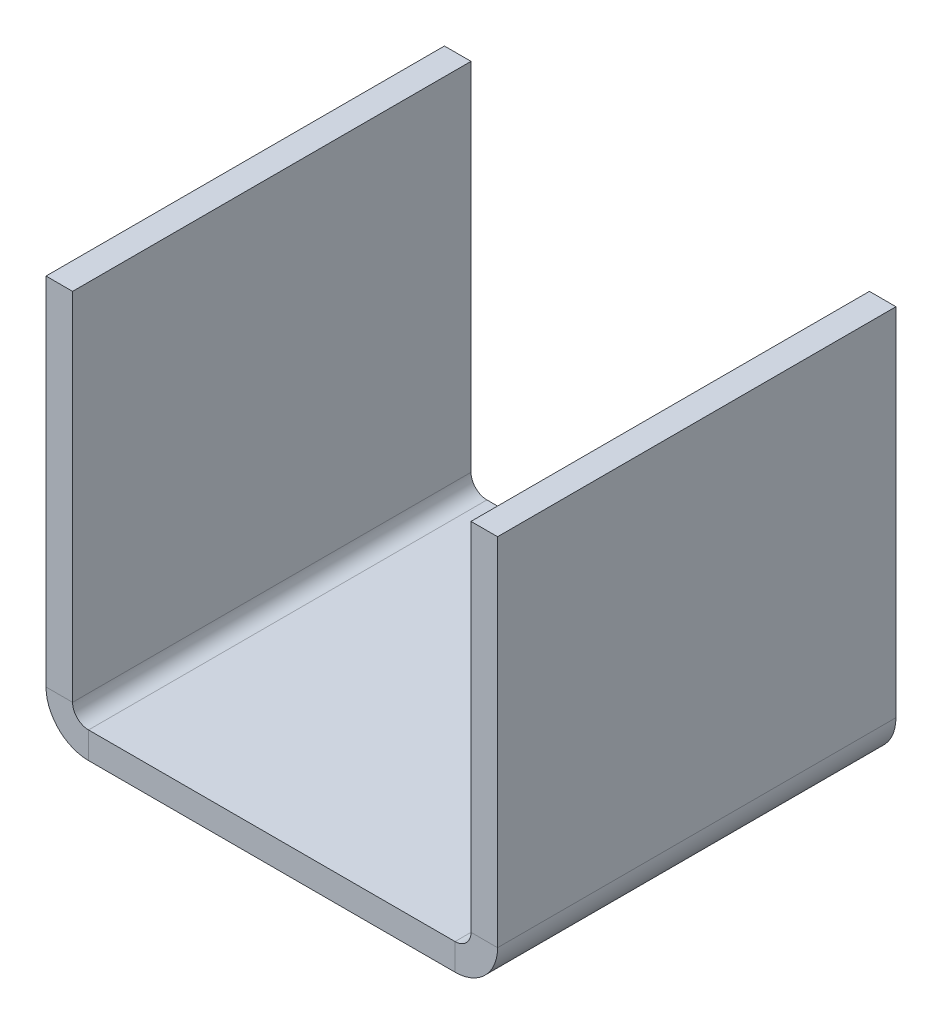
ISO-10303-21;
HEADER;
FILE_DESCRIPTION(('STEP AP214'),'2;1');
FILE_NAME('part.step','',(''),(''),'','','');
FILE_SCHEMA(('AUTOMOTIVE_DESIGN { 1 0 10303 214 1 1 1 1 }'));
ENDSEC;
DATA;
#1=APPLICATION_CONTEXT('core data for automotive mechanical design processes');
#2=APPLICATION_PROTOCOL_DEFINITION('international standard','automotive_design',2000,#1);
#3=PRODUCT_CONTEXT('',#1,'mechanical');
#4=PRODUCT('Part','Part','',(#3));
#5=PRODUCT_RELATED_PRODUCT_CATEGORY('part','',(#4));
#6=PRODUCT_DEFINITION_FORMATION('','',#4);
#7=PRODUCT_DEFINITION_CONTEXT('part definition',#1,'design');
#8=PRODUCT_DEFINITION('design','',#6,#7);
#9=PRODUCT_DEFINITION_SHAPE('','',#8);
#10=(LENGTH_UNIT() NAMED_UNIT(*) SI_UNIT(.MILLI.,.METRE.));
#11=(NAMED_UNIT(*) PLANE_ANGLE_UNIT() SI_UNIT($,.RADIAN.));
#12=(NAMED_UNIT(*) SI_UNIT($,.STERADIAN.) SOLID_ANGLE_UNIT());
#13=UNCERTAINTY_MEASURE_WITH_UNIT(LENGTH_MEASURE(1.E-05),#10,'distance_accuracy_value','');
#14=(GEOMETRIC_REPRESENTATION_CONTEXT(3) GLOBAL_UNCERTAINTY_ASSIGNED_CONTEXT((#13)) GLOBAL_UNIT_ASSIGNED_CONTEXT((#10,
#11,#12)) REPRESENTATION_CONTEXT('',''));
#15=CARTESIAN_POINT('',(0.,0.,0.));
#16=DIRECTION('',(0.,0.,1.));
#17=DIRECTION('',(1.,0.,0.));
#18=AXIS2_PLACEMENT_3D('',#15,#16,#17);
#19=CARTESIAN_POINT('',(-13.8,-2.,15.));
#20=DIRECTION('',(0.,0.,1.));
#21=DIRECTION('',(1.,0.,0.));
#22=AXIS2_PLACEMENT_3D('',#19,#20,#21);
#23=PLANE('',#22);
#24=DIRECTION('',(1.,0.,0.));
#25=VECTOR('',#24,1.);
#26=CARTESIAN_POINT('',(-13.8,0.,15.));
#27=LINE('',#26,#25);
#28=CARTESIAN_POINT('',(-13.8,0.,15.));
#29=VERTEX_POINT('',#28);
#30=CARTESIAN_POINT('',(13.8,0.,15.));
#31=VERTEX_POINT('',#30);
#32=EDGE_CURVE('E119',#29,#31,#27,.T.);
#33=ORIENTED_EDGE('',*,*,#32,.F.);
#34=DIRECTION('',(0.,1.,0.));
#35=VECTOR('',#34,1.);
#36=CARTESIAN_POINT('',(-13.8,-2.,15.));
#37=LINE('',#36,#35);
#38=CARTESIAN_POINT('',(-13.8,-2.,15.));
#39=VERTEX_POINT('',#38);
#40=EDGE_CURVE('E87',#39,#29,#37,.T.);
#41=ORIENTED_EDGE('',*,*,#40,.F.);
#42=DIRECTION('',(1.,0.,0.));
#43=VECTOR('',#42,1.);
#44=CARTESIAN_POINT('',(-13.8,-2.,15.));
#45=LINE('',#44,#43);
#46=CARTESIAN_POINT('',(13.8,-2.,15.));
#47=VERTEX_POINT('',#46);
#48=EDGE_CURVE('E121',#39,#47,#45,.T.);
#49=ORIENTED_EDGE('',*,*,#48,.T.);
#50=DIRECTION('',(0.,1.,0.));
#51=VECTOR('',#50,1.);
#52=CARTESIAN_POINT('',(13.8,-2.,15.));
#53=LINE('',#52,#51);
#54=EDGE_CURVE('E13',#47,#31,#53,.T.);
#55=ORIENTED_EDGE('',*,*,#54,.T.);
#56=EDGE_LOOP('',(#33,#41,#49,#55));
#57=FACE_BOUND('',#56,.T.);
#58=ADVANCED_FACE('F77',(#57),#23,.T.);
#59=CARTESIAN_POINT('',(-13.8,-2.,-15.));
#60=DIRECTION('',(0.,0.,-1.));
#61=DIRECTION('',(-1.,0.,0.));
#62=AXIS2_PLACEMENT_3D('',#59,#60,#61);
#63=PLANE('',#62);
#64=DIRECTION('',(-1.,0.,0.));
#65=VECTOR('',#64,1.);
#66=CARTESIAN_POINT('',(-13.8,0.,-15.));
#67=LINE('',#66,#65);
#68=CARTESIAN_POINT('',(13.8,0.,-15.));
#69=VERTEX_POINT('',#68);
#70=CARTESIAN_POINT('',(-13.8,0.,-15.));
#71=VERTEX_POINT('',#70);
#72=EDGE_CURVE('E142',#69,#71,#67,.T.);
#73=ORIENTED_EDGE('',*,*,#72,.F.);
#74=DIRECTION('',(0.,1.,0.));
#75=VECTOR('',#74,1.);
#76=CARTESIAN_POINT('',(13.8,-2.,-15.));
#77=LINE('',#76,#75);
#78=CARTESIAN_POINT('',(13.8,-2.,-15.));
#79=VERTEX_POINT('',#78);
#80=EDGE_CURVE('E81',#79,#69,#77,.T.);
#81=ORIENTED_EDGE('',*,*,#80,.F.);
#82=DIRECTION('',(-1.,0.,0.));
#83=VECTOR('',#82,1.);
#84=CARTESIAN_POINT('',(-13.8,-2.,-15.));
#85=LINE('',#84,#83);
#86=CARTESIAN_POINT('',(-13.8,-2.,-15.));
#87=VERTEX_POINT('',#86);
#88=EDGE_CURVE('E158',#79,#87,#85,.T.);
#89=ORIENTED_EDGE('',*,*,#88,.T.);
#90=DIRECTION('',(0.,1.,0.));
#91=VECTOR('',#90,1.);
#92=CARTESIAN_POINT('',(-13.8,-2.,-15.));
#93=LINE('',#92,#91);
#94=EDGE_CURVE('E167',#87,#71,#93,.T.);
#95=ORIENTED_EDGE('',*,*,#94,.T.);
#96=EDGE_LOOP('',(#73,#81,#89,#95));
#97=FACE_BOUND('',#96,.T.);
#98=ADVANCED_FACE('F79',(#97),#63,.T.);
#99=CARTESIAN_POINT('',(0.,-2.,0.));
#100=DIRECTION('',(0.,1.,0.));
#101=DIRECTION('',(0.,0.,1.));
#102=AXIS2_PLACEMENT_3D('',#99,#100,#101);
#103=PLANE('',#102);
#104=DIRECTION('',(0.,0.,-1.));
#105=VECTOR('',#104,1.);
#106=CARTESIAN_POINT('',(13.8,-2.,-15.));
#107=LINE('',#106,#105);
#108=EDGE_CURVE('E96',#47,#79,#107,.T.);
#109=ORIENTED_EDGE('',*,*,#108,.F.);
#110=ORIENTED_EDGE('',*,*,#48,.F.);
#111=DIRECTION('',(0.,0.,1.));
#112=VECTOR('',#111,1.);
#113=CARTESIAN_POINT('',(-13.8,-2.,-15.));
#114=LINE('',#113,#112);
#115=EDGE_CURVE('E161',#87,#39,#114,.T.);
#116=ORIENTED_EDGE('',*,*,#115,.F.);
#117=ORIENTED_EDGE('',*,*,#88,.F.);
#118=EDGE_LOOP('',(#109,#110,#116,#117));
#119=FACE_BOUND('',#118,.T.);
#120=ADVANCED_FACE('F339',(#119),#103,.F.);
#121=CARTESIAN_POINT('',(0.,0.,0.));
#122=DIRECTION('',(0.,1.,0.));
#123=DIRECTION('',(0.,0.,1.));
#124=AXIS2_PLACEMENT_3D('',#121,#122,#123);
#125=PLANE('',#124);
#126=DIRECTION('',(0.,0.,-1.));
#127=VECTOR('',#126,1.);
#128=CARTESIAN_POINT('',(13.8,0.,-15.));
#129=LINE('',#128,#127);
#130=EDGE_CURVE('E129',#31,#69,#129,.T.);
#131=ORIENTED_EDGE('',*,*,#130,.T.);
#132=ORIENTED_EDGE('',*,*,#72,.T.);
#133=DIRECTION('',(0.,0.,1.));
#134=VECTOR('',#133,1.);
#135=CARTESIAN_POINT('',(-13.8,0.,-15.));
#136=LINE('',#135,#134);
#137=EDGE_CURVE('E114',#71,#29,#136,.T.);
#138=ORIENTED_EDGE('',*,*,#137,.T.);
#139=ORIENTED_EDGE('',*,*,#32,.T.);
#140=EDGE_LOOP('',(#131,#132,#138,#139));
#141=FACE_BOUND('',#140,.T.);
#142=ADVANCED_FACE('F128',(#141),#125,.T.);
#143=CARTESIAN_POINT('',(13.8,1.2,15.));
#144=DIRECTION('',(0.,0.,1.));
#145=DIRECTION('',(0.,-1.,0.));
#146=AXIS2_PLACEMENT_3D('',#143,#144,#145);
#147=PLANE('',#146);
#148=DIRECTION('',(-1.,0.,0.));
#149=VECTOR('',#148,1.);
#150=CARTESIAN_POINT('',(17.,1.19999999999999,15.));
#151=LINE('',#150,#149);
#152=CARTESIAN_POINT('',(15.,1.2,15.));
#153=VERTEX_POINT('',#152);
#154=CARTESIAN_POINT('',(17.,1.19999999999999,15.));
#155=VERTEX_POINT('',#154);
#156=EDGE_CURVE('E148',#153,#155,#151,.F.);
#157=ORIENTED_EDGE('',*,*,#156,.F.);
#158=CARTESIAN_POINT('',(13.8,1.2,15.));
#159=DIRECTION('',(0.,0.,-1.));
#160=DIRECTION('',(0.,1.,0.));
#161=AXIS2_PLACEMENT_3D('',#158,#159,#160);
#162=CIRCLE('',#161,1.2);
#163=EDGE_CURVE('E138',#31,#153,#162,.F.);
#164=ORIENTED_EDGE('',*,*,#163,.F.);
#165=ORIENTED_EDGE('',*,*,#54,.F.);
#166=CARTESIAN_POINT('',(13.8,1.2,15.));
#167=DIRECTION('',(0.,0.,-1.));
#168=DIRECTION('',(0.,1.,0.));
#169=AXIS2_PLACEMENT_3D('',#166,#167,#168);
#170=CIRCLE('',#169,3.2);
#171=EDGE_CURVE('E143',#47,#155,#170,.F.);
#172=ORIENTED_EDGE('',*,*,#171,.T.);
#173=EDGE_LOOP('',(#157,#164,#165,#172));
#174=FACE_BOUND('',#173,.T.);
#175=ADVANCED_FACE('F146',(#174),#147,.T.);
#176=CARTESIAN_POINT('',(13.8,1.2,-15.));
#177=DIRECTION('',(0.,0.,1.));
#178=DIRECTION('',(0.,-1.,0.));
#179=AXIS2_PLACEMENT_3D('',#176,#177,#178);
#180=PLANE('',#179);
#181=CARTESIAN_POINT('',(13.8,1.2,-15.));
#182=DIRECTION('',(0.,0.,-1.));
#183=DIRECTION('',(0.,1.,0.));
#184=AXIS2_PLACEMENT_3D('',#181,#182,#183);
#185=CIRCLE('',#184,1.2);
#186=CARTESIAN_POINT('',(15.,1.2,-15.));
#187=VERTEX_POINT('',#186);
#188=EDGE_CURVE('E141',#187,#69,#185,.T.);
#189=ORIENTED_EDGE('',*,*,#188,.F.);
#190=DIRECTION('',(-1.,0.,0.));
#191=VECTOR('',#190,1.);
#192=CARTESIAN_POINT('',(15.,1.2,-15.));
#193=LINE('',#192,#191);
#194=CARTESIAN_POINT('',(17.,1.19999999999999,-15.));
#195=VERTEX_POINT('',#194);
#196=EDGE_CURVE('E190',#187,#195,#193,.F.);
#197=ORIENTED_EDGE('',*,*,#196,.T.);
#198=CARTESIAN_POINT('',(13.8,1.2,-15.));
#199=DIRECTION('',(0.,0.,-1.));
#200=DIRECTION('',(0.,1.,0.));
#201=AXIS2_PLACEMENT_3D('',#198,#199,#200);
#202=CIRCLE('',#201,3.2);
#203=EDGE_CURVE('E149',#195,#79,#202,.T.);
#204=ORIENTED_EDGE('',*,*,#203,.T.);
#205=ORIENTED_EDGE('',*,*,#80,.T.);
#206=EDGE_LOOP('',(#189,#197,#204,#205));
#207=FACE_BOUND('',#206,.T.);
#208=ADVANCED_FACE('F172',(#207),#180,.F.);
#209=CARTESIAN_POINT('',(13.8,1.2,-15.));
#210=DIRECTION('',(0.,0.,-1.));
#211=DIRECTION('',(1.,0.,0.));
#212=AXIS2_PLACEMENT_3D('',#209,#210,#211);
#213=CYLINDRICAL_SURFACE('',#212,3.2);
#214=ORIENTED_EDGE('',*,*,#108,.T.);
#215=ORIENTED_EDGE('',*,*,#203,.F.);
#216=DIRECTION('',(0.,0.,-1.));
#217=VECTOR('',#216,1.);
#218=CARTESIAN_POINT('',(17.,1.19999999999999,15.));
#219=LINE('',#218,#217);
#220=EDGE_CURVE('E184',#195,#155,#219,.F.);
#221=ORIENTED_EDGE('',*,*,#220,.T.);
#222=ORIENTED_EDGE('',*,*,#171,.F.);
#223=EDGE_LOOP('',(#214,#215,#221,#222));
#224=FACE_BOUND('',#223,.T.);
#225=ADVANCED_FACE('F180',(#224),#213,.T.);
#226=CARTESIAN_POINT('',(13.8,1.2,-15.));
#227=DIRECTION('',(0.,0.,-1.));
#228=DIRECTION('',(1.,0.,0.));
#229=AXIS2_PLACEMENT_3D('',#226,#227,#228);
#230=CYLINDRICAL_SURFACE('',#229,1.2);
#231=ORIENTED_EDGE('',*,*,#130,.F.);
#232=ORIENTED_EDGE('',*,*,#163,.T.);
#233=DIRECTION('',(0.,0.,-1.));
#234=VECTOR('',#233,1.);
#235=CARTESIAN_POINT('',(15.,1.2,15.));
#236=LINE('',#235,#234);
#237=EDGE_CURVE('E187',#153,#187,#236,.T.);
#238=ORIENTED_EDGE('',*,*,#237,.T.);
#239=ORIENTED_EDGE('',*,*,#188,.T.);
#240=EDGE_LOOP('',(#231,#232,#238,#239));
#241=FACE_BOUND('',#240,.T.);
#242=ADVANCED_FACE('F135',(#241),#230,.F.);
#243=CARTESIAN_POINT('',(17.0000000000001,28.,-15.));
#244=DIRECTION('',(0.,0.,1.));
#245=DIRECTION('',(0.,-1.,0.));
#246=AXIS2_PLACEMENT_3D('',#243,#244,#245);
#247=PLANE('',#246);
#248=ORIENTED_EDGE('',*,*,#196,.F.);
#249=DIRECTION('',(0.,-1.,0.));
#250=VECTOR('',#249,1.);
#251=CARTESIAN_POINT('',(15.0000000000001,28.,-15.));
#252=LINE('',#251,#250);
#253=CARTESIAN_POINT('',(15.0000000000001,28.,-15.));
#254=VERTEX_POINT('',#253);
#255=EDGE_CURVE('E193',#187,#254,#252,.F.);
#256=ORIENTED_EDGE('',*,*,#255,.T.);
#257=DIRECTION('',(-1.,0.,0.));
#258=VECTOR('',#257,1.);
#259=CARTESIAN_POINT('',(17.0000000000001,28.,-15.));
#260=LINE('',#259,#258);
#261=CARTESIAN_POINT('',(17.0000000000001,28.,-15.));
#262=VERTEX_POINT('',#261);
#263=EDGE_CURVE('E153',#262,#254,#260,.T.);
#264=ORIENTED_EDGE('',*,*,#263,.F.);
#265=DIRECTION('',(0.,1.,0.));
#266=VECTOR('',#265,1.);
#267=CARTESIAN_POINT('',(17.,0.,-15.));
#268=LINE('',#267,#266);
#269=EDGE_CURVE('E202',#195,#262,#268,.T.);
#270=ORIENTED_EDGE('',*,*,#269,.F.);
#271=EDGE_LOOP('',(#248,#256,#264,#270));
#272=FACE_BOUND('',#271,.T.);
#273=ADVANCED_FACE('F323',(#272),#247,.F.);
#274=CARTESIAN_POINT('',(17.,0.,15.));
#275=DIRECTION('',(0.,0.,-1.));
#276=DIRECTION('',(-1.,0.,0.));
#277=AXIS2_PLACEMENT_3D('',#274,#275,#276);
#278=PLANE('',#277);
#279=ORIENTED_EDGE('',*,*,#156,.T.);
#280=DIRECTION('',(0.,-1.,0.));
#281=VECTOR('',#280,1.);
#282=CARTESIAN_POINT('',(17.,0.,15.));
#283=LINE('',#282,#281);
#284=CARTESIAN_POINT('',(17.0000000000001,28.,15.));
#285=VERTEX_POINT('',#284);
#286=EDGE_CURVE('E208',#285,#155,#283,.T.);
#287=ORIENTED_EDGE('',*,*,#286,.F.);
#288=DIRECTION('',(-1.,0.,0.));
#289=VECTOR('',#288,1.);
#290=CARTESIAN_POINT('',(17.0000000000001,28.,15.));
#291=LINE('',#290,#289);
#292=CARTESIAN_POINT('',(15.0000000000001,28.,15.));
#293=VERTEX_POINT('',#292);
#294=EDGE_CURVE('E211',#285,#293,#291,.T.);
#295=ORIENTED_EDGE('',*,*,#294,.T.);
#296=DIRECTION('',(0.,1.,0.));
#297=VECTOR('',#296,1.);
#298=CARTESIAN_POINT('',(15.,0.,15.));
#299=LINE('',#298,#297);
#300=EDGE_CURVE('E199',#293,#153,#299,.F.);
#301=ORIENTED_EDGE('',*,*,#300,.T.);
#302=EDGE_LOOP('',(#279,#287,#295,#301));
#303=FACE_BOUND('',#302,.T.);
#304=ADVANCED_FACE('F314',(#303),#278,.F.);
#305=CARTESIAN_POINT('',(17.,0.,0.));
#306=DIRECTION('',(-1.,0.,0.));
#307=DIRECTION('',(0.,-1.,0.));
#308=AXIS2_PLACEMENT_3D('',#305,#306,#307);
#309=PLANE('',#308);
#310=ORIENTED_EDGE('',*,*,#220,.F.);
#311=ORIENTED_EDGE('',*,*,#269,.T.);
#312=DIRECTION('',(0.,0.,1.));
#313=VECTOR('',#312,1.);
#314=CARTESIAN_POINT('',(17.0000000000001,28.,0.));
#315=LINE('',#314,#313);
#316=EDGE_CURVE('E205',#262,#285,#315,.T.);
#317=ORIENTED_EDGE('',*,*,#316,.T.);
#318=ORIENTED_EDGE('',*,*,#286,.T.);
#319=EDGE_LOOP('',(#310,#311,#317,#318));
#320=FACE_BOUND('',#319,.T.);
#321=ADVANCED_FACE('F325',(#320),#309,.F.);
#322=CARTESIAN_POINT('',(15.,0.,0.));
#323=DIRECTION('',(-1.,0.,0.));
#324=DIRECTION('',(0.,-1.,0.));
#325=AXIS2_PLACEMENT_3D('',#322,#323,#324);
#326=PLANE('',#325);
#327=ORIENTED_EDGE('',*,*,#255,.F.);
#328=ORIENTED_EDGE('',*,*,#237,.F.);
#329=ORIENTED_EDGE('',*,*,#300,.F.);
#330=DIRECTION('',(0.,0.,-1.));
#331=VECTOR('',#330,1.);
#332=CARTESIAN_POINT('',(15.0000000000001,28.,15.));
#333=LINE('',#332,#331);
#334=EDGE_CURVE('E196',#254,#293,#333,.F.);
#335=ORIENTED_EDGE('',*,*,#334,.F.);
#336=EDGE_LOOP('',(#327,#328,#329,#335));
#337=FACE_BOUND('',#336,.T.);
#338=ADVANCED_FACE('F311',(#337),#326,.T.);
#339=CARTESIAN_POINT('',(17.0000000000001,28.,15.));
#340=DIRECTION('',(0.,-1.,0.));
#341=DIRECTION('',(1.,0.,0.));
#342=AXIS2_PLACEMENT_3D('',#339,#340,#341);
#343=PLANE('',#342);
#344=ORIENTED_EDGE('',*,*,#334,.T.);
#345=ORIENTED_EDGE('',*,*,#294,.F.);
#346=ORIENTED_EDGE('',*,*,#316,.F.);
#347=ORIENTED_EDGE('',*,*,#263,.T.);
#348=EDGE_LOOP('',(#344,#345,#346,#347));
#349=FACE_BOUND('',#348,.T.);
#350=ADVANCED_FACE('F319',(#349),#343,.F.);
#351=CARTESIAN_POINT('',(-13.8,1.2,-15.));
#352=DIRECTION('',(0.,0.,-1.));
#353=DIRECTION('',(-1.,0.,0.));
#354=AXIS2_PLACEMENT_3D('',#351,#352,#353);
#355=PLANE('',#354);
#356=DIRECTION('',(1.,0.,0.));
#357=VECTOR('',#356,1.);
#358=CARTESIAN_POINT('',(-17.,1.19999999999999,-15.));
#359=LINE('',#358,#357);
#360=CARTESIAN_POINT('',(-15.,1.2,-15.));
#361=VERTEX_POINT('',#360);
#362=CARTESIAN_POINT('',(-17.,1.19999999999999,-15.));
#363=VERTEX_POINT('',#362);
#364=EDGE_CURVE('E228',#361,#363,#359,.F.);
#365=ORIENTED_EDGE('',*,*,#364,.F.);
#366=CARTESIAN_POINT('',(-13.8,1.2,-15.));
#367=DIRECTION('',(0.,0.,1.));
#368=DIRECTION('',(1.,0.,0.));
#369=AXIS2_PLACEMENT_3D('',#366,#367,#368);
#370=CIRCLE('',#369,1.2);
#371=EDGE_CURVE('E219',#71,#361,#370,.F.);
#372=ORIENTED_EDGE('',*,*,#371,.F.);
#373=ORIENTED_EDGE('',*,*,#94,.F.);
#374=CARTESIAN_POINT('',(-13.8,1.2,-15.));
#375=DIRECTION('',(0.,0.,1.));
#376=DIRECTION('',(1.,0.,0.));
#377=AXIS2_PLACEMENT_3D('',#374,#375,#376);
#378=CIRCLE('',#377,3.2);
#379=EDGE_CURVE('E188',#87,#363,#378,.F.);
#380=ORIENTED_EDGE('',*,*,#379,.T.);
#381=EDGE_LOOP('',(#365,#372,#373,#380));
#382=FACE_BOUND('',#381,.T.);
#383=ADVANCED_FACE('F356',(#382),#355,.T.);
#384=CARTESIAN_POINT('',(-13.8,1.2,15.));
#385=DIRECTION('',(0.,0.,-1.));
#386=DIRECTION('',(-1.,0.,0.));
#387=AXIS2_PLACEMENT_3D('',#384,#385,#386);
#388=PLANE('',#387);
#389=CARTESIAN_POINT('',(-13.8,1.2,15.));
#390=DIRECTION('',(0.,0.,1.));
#391=DIRECTION('',(1.,0.,0.));
#392=AXIS2_PLACEMENT_3D('',#389,#390,#391);
#393=CIRCLE('',#392,1.2);
#394=CARTESIAN_POINT('',(-15.,1.2,15.));
#395=VERTEX_POINT('',#394);
#396=EDGE_CURVE('E216',#395,#29,#393,.T.);
#397=ORIENTED_EDGE('',*,*,#396,.F.);
#398=DIRECTION('',(1.,0.,0.));
#399=VECTOR('',#398,1.);
#400=CARTESIAN_POINT('',(-15.,1.2,15.));
#401=LINE('',#400,#399);
#402=CARTESIAN_POINT('',(-17.,1.19999999999999,15.));
#403=VERTEX_POINT('',#402);
#404=EDGE_CURVE('E234',#395,#403,#401,.F.);
#405=ORIENTED_EDGE('',*,*,#404,.T.);
#406=CARTESIAN_POINT('',(-13.8,1.2,15.));
#407=DIRECTION('',(0.,0.,1.));
#408=DIRECTION('',(1.,0.,0.));
#409=AXIS2_PLACEMENT_3D('',#406,#407,#408);
#410=CIRCLE('',#409,3.2);
#411=EDGE_CURVE('E223',#403,#39,#410,.T.);
#412=ORIENTED_EDGE('',*,*,#411,.T.);
#413=ORIENTED_EDGE('',*,*,#40,.T.);
#414=EDGE_LOOP('',(#397,#405,#412,#413));
#415=FACE_BOUND('',#414,.T.);
#416=ADVANCED_FACE('F360',(#415),#388,.F.);
#417=CARTESIAN_POINT('',(-13.8,1.2,15.));
#418=DIRECTION('',(0.,0.,1.));
#419=DIRECTION('',(-1.,0.,0.));
#420=AXIS2_PLACEMENT_3D('',#417,#418,#419);
#421=CYLINDRICAL_SURFACE('',#420,3.2);
#422=ORIENTED_EDGE('',*,*,#115,.T.);
#423=ORIENTED_EDGE('',*,*,#411,.F.);
#424=DIRECTION('',(0.,0.,1.));
#425=VECTOR('',#424,1.);
#426=CARTESIAN_POINT('',(-17.,1.19999999999999,-15.));
#427=LINE('',#426,#425);
#428=EDGE_CURVE('E237',#403,#363,#427,.F.);
#429=ORIENTED_EDGE('',*,*,#428,.T.);
#430=ORIENTED_EDGE('',*,*,#379,.F.);
#431=EDGE_LOOP('',(#422,#423,#429,#430));
#432=FACE_BOUND('',#431,.T.);
#433=ADVANCED_FACE('F365',(#432),#421,.T.);
#434=CARTESIAN_POINT('',(-13.8,1.2,15.));
#435=DIRECTION('',(0.,0.,1.));
#436=DIRECTION('',(-1.,0.,0.));
#437=AXIS2_PLACEMENT_3D('',#434,#435,#436);
#438=CYLINDRICAL_SURFACE('',#437,1.2);
#439=ORIENTED_EDGE('',*,*,#137,.F.);
#440=ORIENTED_EDGE('',*,*,#371,.T.);
#441=DIRECTION('',(0.,0.,1.));
#442=VECTOR('',#441,1.);
#443=CARTESIAN_POINT('',(-15.,1.2,-15.));
#444=LINE('',#443,#442);
#445=EDGE_CURVE('E231',#361,#395,#444,.T.);
#446=ORIENTED_EDGE('',*,*,#445,.T.);
#447=ORIENTED_EDGE('',*,*,#396,.T.);
#448=EDGE_LOOP('',(#439,#440,#446,#447));
#449=FACE_BOUND('',#448,.T.);
#450=ADVANCED_FACE('F368',(#449),#438,.F.);
#451=CARTESIAN_POINT('',(-17.,0.,-15.));
#452=DIRECTION('',(0.,0.,1.));
#453=DIRECTION('',(0.,-1.,0.));
#454=AXIS2_PLACEMENT_3D('',#451,#452,#453);
#455=PLANE('',#454);
#456=ORIENTED_EDGE('',*,*,#364,.T.);
#457=DIRECTION('',(0.,-1.,0.));
#458=VECTOR('',#457,1.);
#459=CARTESIAN_POINT('',(-17.,0.,-15.));
#460=LINE('',#459,#458);
#461=CARTESIAN_POINT('',(-17.0000000000001,28.,-15.));
#462=VERTEX_POINT('',#461);
#463=EDGE_CURVE('E249',#462,#363,#460,.T.);
#464=ORIENTED_EDGE('',*,*,#463,.F.);
#465=DIRECTION('',(1.,0.,0.));
#466=VECTOR('',#465,1.);
#467=CARTESIAN_POINT('',(-17.0000000000001,28.,-15.));
#468=LINE('',#467,#466);
#469=CARTESIAN_POINT('',(-15.0000000000001,28.,-15.));
#470=VERTEX_POINT('',#469);
#471=EDGE_CURVE('E258',#462,#470,#468,.T.);
#472=ORIENTED_EDGE('',*,*,#471,.T.);
#473=DIRECTION('',(0.,1.,0.));
#474=VECTOR('',#473,1.);
#475=CARTESIAN_POINT('',(-15.,0.,-15.));
#476=LINE('',#475,#474);
#477=EDGE_CURVE('E240',#470,#361,#476,.F.);
#478=ORIENTED_EDGE('',*,*,#477,.T.);
#479=EDGE_LOOP('',(#456,#464,#472,#478));
#480=FACE_BOUND('',#479,.T.);
#481=ADVANCED_FACE('F284',(#480),#455,.F.);
#482=CARTESIAN_POINT('',(-17.0000000000001,28.,15.));
#483=DIRECTION('',(0.,0.,-1.));
#484=DIRECTION('',(-1.,0.,0.));
#485=AXIS2_PLACEMENT_3D('',#482,#483,#484);
#486=PLANE('',#485);
#487=ORIENTED_EDGE('',*,*,#404,.F.);
#488=DIRECTION('',(0.,-1.,0.));
#489=VECTOR('',#488,1.);
#490=CARTESIAN_POINT('',(-15.0000000000001,28.,15.));
#491=LINE('',#490,#489);
#492=CARTESIAN_POINT('',(-15.0000000000001,28.,15.));
#493=VERTEX_POINT('',#492);
#494=EDGE_CURVE('E243',#395,#493,#491,.F.);
#495=ORIENTED_EDGE('',*,*,#494,.T.);
#496=DIRECTION('',(1.,0.,0.));
#497=VECTOR('',#496,1.);
#498=CARTESIAN_POINT('',(-17.0000000000001,28.,15.));
#499=LINE('',#498,#497);
#500=CARTESIAN_POINT('',(-17.0000000000001,28.,15.));
#501=VERTEX_POINT('',#500);
#502=EDGE_CURVE('E220',#501,#493,#499,.T.);
#503=ORIENTED_EDGE('',*,*,#502,.F.);
#504=DIRECTION('',(0.,1.,0.));
#505=VECTOR('',#504,1.);
#506=CARTESIAN_POINT('',(-17.,0.,15.));
#507=LINE('',#506,#505);
#508=EDGE_CURVE('E252',#403,#501,#507,.T.);
#509=ORIENTED_EDGE('',*,*,#508,.F.);
#510=EDGE_LOOP('',(#487,#495,#503,#509));
#511=FACE_BOUND('',#510,.T.);
#512=ADVANCED_FACE('F377',(#511),#486,.F.);
#513=CARTESIAN_POINT('',(-17.,0.,0.));
#514=DIRECTION('',(1.,0.,0.));
#515=DIRECTION('',(0.,1.,0.));
#516=AXIS2_PLACEMENT_3D('',#513,#514,#515);
#517=PLANE('',#516);
#518=ORIENTED_EDGE('',*,*,#428,.F.);
#519=ORIENTED_EDGE('',*,*,#508,.T.);
#520=DIRECTION('',(0.,0.,-1.));
#521=VECTOR('',#520,1.);
#522=CARTESIAN_POINT('',(-17.0000000000001,28.,0.));
#523=LINE('',#522,#521);
#524=EDGE_CURVE('E255',#501,#462,#523,.T.);
#525=ORIENTED_EDGE('',*,*,#524,.T.);
#526=ORIENTED_EDGE('',*,*,#463,.T.);
#527=EDGE_LOOP('',(#518,#519,#525,#526));
#528=FACE_BOUND('',#527,.T.);
#529=ADVANCED_FACE('F380',(#528),#517,.F.);
#530=CARTESIAN_POINT('',(-15.,0.,0.));
#531=DIRECTION('',(1.,0.,0.));
#532=DIRECTION('',(0.,1.,0.));
#533=AXIS2_PLACEMENT_3D('',#530,#531,#532);
#534=PLANE('',#533);
#535=ORIENTED_EDGE('',*,*,#494,.F.);
#536=ORIENTED_EDGE('',*,*,#445,.F.);
#537=ORIENTED_EDGE('',*,*,#477,.F.);
#538=DIRECTION('',(0.,0.,1.));
#539=VECTOR('',#538,1.);
#540=CARTESIAN_POINT('',(-15.0000000000001,28.,-15.));
#541=LINE('',#540,#539);
#542=EDGE_CURVE('E246',#493,#470,#541,.F.);
#543=ORIENTED_EDGE('',*,*,#542,.F.);
#544=EDGE_LOOP('',(#535,#536,#537,#543));
#545=FACE_BOUND('',#544,.T.);
#546=ADVANCED_FACE('F278',(#545),#534,.T.);
#547=CARTESIAN_POINT('',(-17.0000000000001,28.,-15.));
#548=DIRECTION('',(0.,-1.,0.));
#549=DIRECTION('',(1.,0.,0.));
#550=AXIS2_PLACEMENT_3D('',#547,#548,#549);
#551=PLANE('',#550);
#552=ORIENTED_EDGE('',*,*,#542,.T.);
#553=ORIENTED_EDGE('',*,*,#471,.F.);
#554=ORIENTED_EDGE('',*,*,#524,.F.);
#555=ORIENTED_EDGE('',*,*,#502,.T.);
#556=EDGE_LOOP('',(#552,#553,#554,#555));
#557=FACE_BOUND('',#556,.T.);
#558=ADVANCED_FACE('F267',(#557),#551,.F.);
#559=CLOSED_SHELL('',(#58,#98,#120,#142,#175,#208,#225,#242,#273,#304,#321,#338,#350,#383,#416,
#433,#450,#481,#512,#529,#546,#558));
#560=MANIFOLD_SOLID_BREP('B2',#559);
#561=ADVANCED_BREP_SHAPE_REPRESENTATION('',(#18,#560),#14);
#562=SHAPE_DEFINITION_REPRESENTATION(#9,#561);
ENDSEC;
END-ISO-10303-21;
